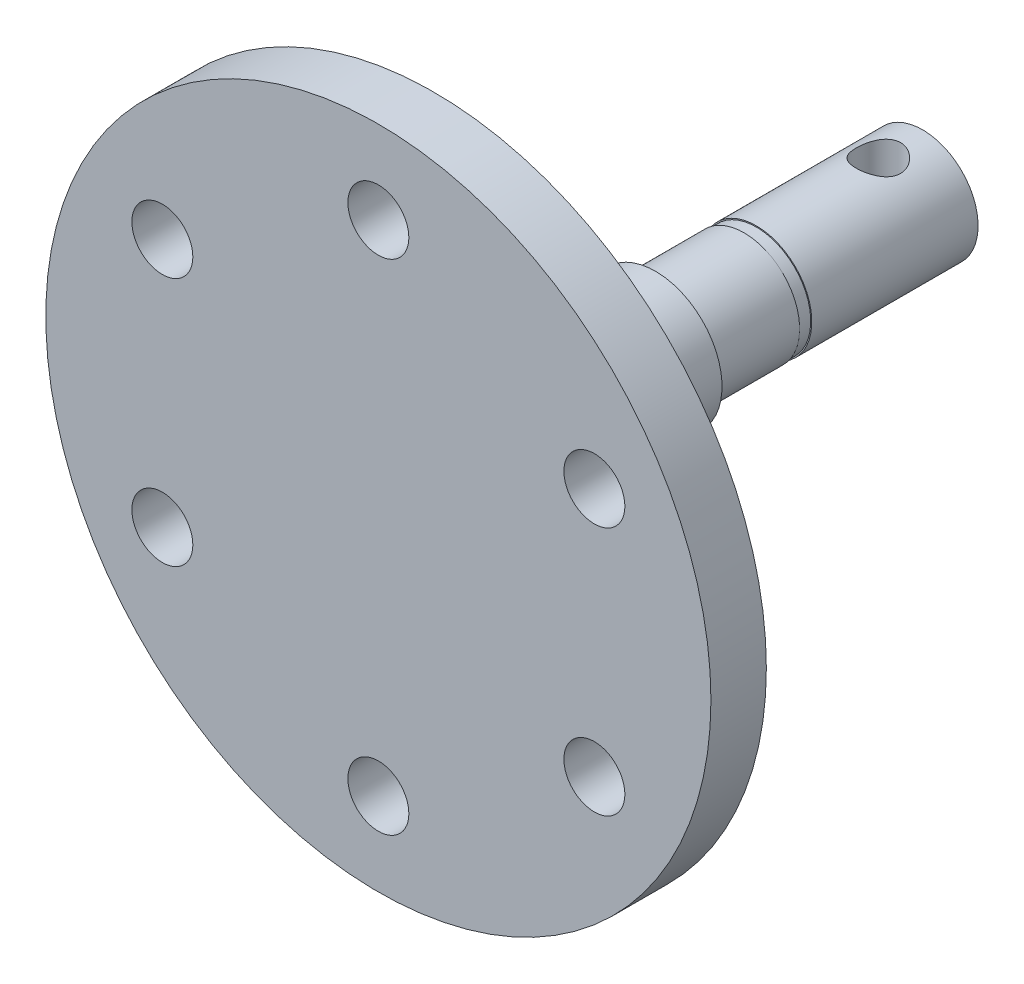
ISO-10303-21;
HEADER;
FILE_DESCRIPTION(('STEP AP214'),'2;1');
FILE_NAME('part.step','',(''),(''),'','','');
FILE_SCHEMA(('AUTOMOTIVE_DESIGN { 1 0 10303 214 1 1 1 1 }'));
ENDSEC;
DATA;
#1=APPLICATION_CONTEXT('core data for automotive mechanical design processes');
#2=APPLICATION_PROTOCOL_DEFINITION('international standard','automotive_design',2000,#1);
#3=PRODUCT_CONTEXT('',#1,'mechanical');
#4=PRODUCT('Part','Part','',(#3));
#5=PRODUCT_RELATED_PRODUCT_CATEGORY('part','',(#4));
#6=PRODUCT_DEFINITION_FORMATION('','',#4);
#7=PRODUCT_DEFINITION_CONTEXT('part definition',#1,'design');
#8=PRODUCT_DEFINITION('design','',#6,#7);
#9=PRODUCT_DEFINITION_SHAPE('','',#8);
#10=(LENGTH_UNIT() NAMED_UNIT(*) SI_UNIT(.MILLI.,.METRE.));
#11=(NAMED_UNIT(*) PLANE_ANGLE_UNIT() SI_UNIT($,.RADIAN.));
#12=(NAMED_UNIT(*) SI_UNIT($,.STERADIAN.) SOLID_ANGLE_UNIT());
#13=UNCERTAINTY_MEASURE_WITH_UNIT(LENGTH_MEASURE(1.E-05),#10,'distance_accuracy_value','');
#14=(GEOMETRIC_REPRESENTATION_CONTEXT(3) GLOBAL_UNCERTAINTY_ASSIGNED_CONTEXT((#13)) GLOBAL_UNIT_ASSIGNED_CONTEXT((#10,
#11,#12)) REPRESENTATION_CONTEXT('',''));
#15=CARTESIAN_POINT('',(0.,0.,0.));
#16=DIRECTION('',(0.,0.,1.));
#17=DIRECTION('',(1.,0.,0.));
#18=AXIS2_PLACEMENT_3D('',#15,#16,#17);
#19=CARTESIAN_POINT('',(0.,0.,-44.1));
#20=DIRECTION('',(0.,0.,1.));
#21=DIRECTION('',(1.,0.,0.));
#22=AXIS2_PLACEMENT_3D('',#19,#20,#21);
#23=CYLINDRICAL_SURFACE('',#22,5.);
#24=CARTESIAN_POINT('',(0.,0.,-44.1));
#25=DIRECTION('',(0.,0.,-1.));
#26=DIRECTION('',(-1.,0.,0.));
#27=AXIS2_PLACEMENT_3D('',#24,#25,#26);
#28=CIRCLE('',#27,5.);
#29=CARTESIAN_POINT('',(-5.,0.,-44.1));
#30=VERTEX_POINT('',#29);
#31=EDGE_CURVE('E149',#30,#30,#28,.T.);
#32=ORIENTED_EDGE('',*,*,#31,.F.);
#33=EDGE_LOOP('',(#32));
#34=FACE_BOUND('',#33,.T.);
#35=CARTESIAN_POINT('',(0.,0.,-29.1));
#36=DIRECTION('',(0.,0.,-1.));
#37=DIRECTION('',(-1.,0.,0.));
#38=AXIS2_PLACEMENT_3D('',#35,#36,#37);
#39=CIRCLE('',#38,5.);
#40=CARTESIAN_POINT('',(-5.,0.,-29.1));
#41=VERTEX_POINT('',#40);
#42=EDGE_CURVE('E153',#41,#41,#39,.T.);
#43=ORIENTED_EDGE('',*,*,#42,.T.);
#44=EDGE_LOOP('',(#43));
#45=FACE_BOUND('',#44,.T.);
#46=CARTESIAN_POINT('',(0.,-5.,-42.1));
#47=CARTESIAN_POINT('',(0.107493005442891,-4.99999271227085,-42.0999901481763));
#48=CARTESIAN_POINT('',(0.215172564090672,-4.99649294306933,-42.0912822479116));
#49=CARTESIAN_POINT('',(0.427496480417895,-4.98283453100642,-42.0567522964788));
#50=CARTESIAN_POINT('',(0.532131777561248,-4.97265778698877,-42.0308837209139));
#51=CARTESIAN_POINT('',(0.734953922727403,-4.94674209213118,-41.9631239219412));
#52=CARTESIAN_POINT('',(0.833160661616959,-4.93102136364072,-41.9212851537833));
#53=CARTESIAN_POINT('',(1.02107197032837,-4.89556610796078,-41.8229808266735));
#54=CARTESIAN_POINT('',(1.11077947675099,-4.87583297458057,-41.7665203450811));
#55=CARTESIAN_POINT('',(1.28350100757039,-4.83330886170419,-41.6377645014391));
#56=CARTESIAN_POINT('',(1.36606227255021,-4.81042296929191,-41.5648933437597));
#57=CARTESIAN_POINT('',(1.51817500478472,-4.76460576906195,-41.4065999965232));
#58=CARTESIAN_POINT('',(1.58772010713353,-4.74167444453792,-41.3211717027883));
#59=CARTESIAN_POINT('',(1.71487456729288,-4.69722791797136,-41.1355719297577));
#60=CARTESIAN_POINT('',(1.77181498119547,-4.67582115964951,-41.0349135139768));
#61=CARTESIAN_POINT('',(1.86775471903715,-4.63833647186793,-40.82446360158));
#62=CARTESIAN_POINT('',(1.90676256428583,-4.62225601244176,-40.7146764721516));
#63=CARTESIAN_POINT('',(1.96389882339587,-4.59826357660818,-40.4942876664079));
#64=CARTESIAN_POINT('',(1.98289396580565,-4.59001420355605,-40.3839487644238));
#65=CARTESIAN_POINT('',(2.00217296164003,-4.58164004049144,-40.1613650016927));
#66=CARTESIAN_POINT('',(2.00246601631322,-4.58151125522768,-40.049121105375));
#67=CARTESIAN_POINT('',(1.98498936750454,-4.58910500279994,-39.834243328542));
#68=CARTESIAN_POINT('',(1.96847531430514,-4.5962817503845,-39.731484285591));
#69=CARTESIAN_POINT('',(1.91994688029782,-4.61676187607836,-39.5303404439933));
#70=CARTESIAN_POINT('',(1.88792979480463,-4.63006632321673,-39.4319564118897));
#71=CARTESIAN_POINT('',(1.80869473255107,-4.6615948508853,-39.239982163804));
#72=CARTESIAN_POINT('',(1.76117986231532,-4.67991379280788,-39.1465307609453));
#73=CARTESIAN_POINT('',(1.65250646073221,-4.7193811638989,-38.9685841836384));
#74=CARTESIAN_POINT('',(1.59134280510084,-4.74053065456848,-38.8840923905972));
#75=CARTESIAN_POINT('',(1.45155059945443,-4.78526736742271,-38.719590271198));
#76=CARTESIAN_POINT('',(1.37193746297063,-4.80891664976152,-38.640431270554));
#77=CARTESIAN_POINT('',(1.20031442743019,-4.85459824958282,-38.496315521998));
#78=CARTESIAN_POINT('',(1.10830206533443,-4.87663024445325,-38.4313616025897));
#79=CARTESIAN_POINT('',(0.912077652605842,-4.91714681264548,-38.3163825525842));
#80=CARTESIAN_POINT('',(0.807660491346476,-4.93555270095415,-38.2666777188029));
#81=CARTESIAN_POINT('',(0.59102376548288,-4.96614828328759,-38.1858321389219));
#82=CARTESIAN_POINT('',(0.478808196849672,-4.97834113462382,-38.1546819624426));
#83=CARTESIAN_POINT('',(0.256895887607818,-4.99456139506911,-38.1135517045803));
#84=CARTESIAN_POINT('',(0.147443293985534,-4.99902945833514,-38.1024275457464));
#85=CARTESIAN_POINT('',(-0.0718453098078174,-5.00068478510631,-38.0982868994714));
#86=CARTESIAN_POINT('',(-0.181681213223924,-4.99787393582291,-38.1052657184525));
#87=CARTESIAN_POINT('',(-0.393432739121987,-4.98557567063753,-38.136291752552));
#88=CARTESIAN_POINT('',(-0.495482491775473,-4.97639391345523,-38.159557980351));
#89=CARTESIAN_POINT('',(-0.69413542806078,-4.952594414055,-38.2214357083098));
#90=CARTESIAN_POINT('',(-0.790737910224845,-4.9379759735653,-38.2600491796687));
#91=CARTESIAN_POINT('',(-0.979078785816702,-4.90416594770812,-38.3527849396799));
#92=CARTESIAN_POINT('',(-1.0705780227554,-4.88484815979804,-38.4073454720431));
#93=CARTESIAN_POINT('',(-1.24344359124655,-4.84373364745525,-38.5299403239056));
#94=CARTESIAN_POINT('',(-1.32480584076112,-4.82193593110271,-38.5979800429226));
#95=CARTESIAN_POINT('',(-1.48072304302882,-4.77645117638112,-38.7508700129496));
#96=CARTESIAN_POINT('',(-1.55447393380606,-4.75273441425052,-38.8365335415062));
#97=CARTESIAN_POINT('',(-1.68675119741371,-4.70741672917132,-39.0194400830094));
#98=CARTESIAN_POINT('',(-1.74527506133751,-4.68581615526511,-39.1166850003399));
#99=CARTESIAN_POINT('',(-1.84580750193163,-4.64714299907709,-39.3214616945941));
#100=CARTESIAN_POINT('',(-1.88765059453445,-4.63011630884788,-39.4290839992123));
#101=CARTESIAN_POINT('',(-1.9522962197053,-4.60323673477931,-39.6507336517152));
#102=CARTESIAN_POINT('',(-1.97511280526931,-4.59337855695998,-39.7647562058124));
#103=CARTESIAN_POINT('',(-1.9997156172784,-4.58271759299926,-39.9871279017745));
#104=CARTESIAN_POINT('',(-2.00289708230287,-4.58131421008171,-40.0952948395933));
#105=CARTESIAN_POINT('',(-1.99180315927753,-4.58614836033098,-40.3105448577133));
#106=CARTESIAN_POINT('',(-1.97752998791378,-4.59238492324793,-40.4176280739026));
#107=CARTESIAN_POINT('',(-1.93307136615365,-4.61126649079021,-40.623332189855));
#108=CARTESIAN_POINT('',(-1.90353749357098,-4.62364831827449,-40.722120274433));
#109=CARTESIAN_POINT('',(-1.83000544849101,-4.65324001232697,-40.9133786296135));
#110=CARTESIAN_POINT('',(-1.78600328139381,-4.67045121206007,-41.0058471468998));
#111=CARTESIAN_POINT('',(-1.68187276275973,-4.70898609604492,-41.1876096192708));
#112=CARTESIAN_POINT('',(-1.62096533515949,-4.73048882313242,-41.2764186701305));
#113=CARTESIAN_POINT('',(-1.4858921192715,-4.77463804372237,-41.4429933172038));
#114=CARTESIAN_POINT('',(-1.41172233481812,-4.79728488048406,-41.5207555721283));
#115=CARTESIAN_POINT('',(-1.24650550627246,-4.84293567087394,-41.6682028532636));
#116=CARTESIAN_POINT('',(-1.15467600114614,-4.86586757962185,-41.7370373068981));
#117=CARTESIAN_POINT('',(-0.959900320285779,-4.90800406713717,-41.8583370426216));
#118=CARTESIAN_POINT('',(-0.856949004547238,-4.92720691092906,-41.9107947121525));
#119=CARTESIAN_POINT('',(-0.644738062495205,-4.95939714815861,-41.9966222151903));
#120=CARTESIAN_POINT('',(-0.535631618219697,-4.97249363055028,-42.0303293235603));
#121=CARTESIAN_POINT('',(-0.312876546281221,-4.99144306209366,-42.0786391209543));
#122=CARTESIAN_POINT('',(-0.199243525858912,-4.99731899495638,-42.0933024367439));
#123=CARTESIAN_POINT('',(-0.0569122978909287,-4.99975899504136,-42.0993953809783));
#124=CARTESIAN_POINT('',(-0.0284626887407579,-5.00000192969176,-42.1000026086292));
#125=CARTESIAN_POINT('',(0.,-5.,-42.1));
#126=B_SPLINE_CURVE_WITH_KNOTS('',3,(#46,#47,#48,#49,#50,#51,#52,#53,#54,#55,#56,#57,#58,#59,
#60,#61,#62,#63,#64,#65,#66,#67,#68,#69,#70,#71,#72,#73,#74,#75,#76,#77,#78,#79,#80,#81,#82,#83,
#84,#85,#86,#87,#88,#89,#90,#91,#92,#93,#94,#95,#96,#97,#98,#99,#100,#101,#102,#103,#104,#105,
#106,#107,#108,#109,#110,#111,#112,#113,#114,#115,#116,#117,#118,#119,#120,#121,#122,#123,#124,
#125),.UNSPECIFIED.,.T.,.F.,(4,2,2,2,2,2,2,2,2,2,2,2,2,2,2,2,2,2,2,2,2,2,2,2,2,2,2,2,2,2,2,2,2,
2,2,2,2,2,2,4),(0.,0.32240298789307,0.645683636007934,0.96791145747158,1.29002753567984,
1.62597381700397,1.96208394934412,2.31315258819217,2.66405423118268,2.99904105308829,
3.33386306340488,3.64538328401372,3.95695787256048,4.27489126298815,4.59294421938184,
4.93558349186558,5.27829092839733,5.62776913162806,5.97706956113791,6.30569184528008,
6.63422893570082,6.94800455564366,7.26182048993797,7.58523513398263,7.90877959498969,
8.25368474624414,8.59864669043748,8.94695045140828,9.29499672645933,9.61799673392747,
9.94095572563046,10.2511431854877,10.5614163580516,10.8894546805669,11.2175920134839,
11.5670042353384,11.9165786364053,12.2596430101332,12.6016125240434,12.686980458968),.UNSPECIFIED.);
#127=CARTESIAN_POINT('',(0.,-5.,-42.1));
#128=VERTEX_POINT('',#127);
#129=EDGE_CURVE('E112',#128,#128,#126,.T.);
#130=ORIENTED_EDGE('',*,*,#129,.F.);
#131=EDGE_LOOP('',(#130));
#132=FACE_BOUND('',#131,.T.);
#133=CARTESIAN_POINT('',(0.,5.,-42.1));
#134=CARTESIAN_POINT('',(-0.107493005442891,4.99999271227085,-42.0999901481763));
#135=CARTESIAN_POINT('',(-0.215172564090672,4.99649294306933,-42.0912822479116));
#136=CARTESIAN_POINT('',(-0.427496480417895,4.98283453100642,-42.0567522964788));
#137=CARTESIAN_POINT('',(-0.532131777561248,4.97265778698877,-42.0308837209139));
#138=CARTESIAN_POINT('',(-0.734953922727403,4.94674209213118,-41.9631239219412));
#139=CARTESIAN_POINT('',(-0.833160661616959,4.93102136364072,-41.9212851537833));
#140=CARTESIAN_POINT('',(-1.02107197032837,4.89556610796078,-41.8229808266735));
#141=CARTESIAN_POINT('',(-1.11077947675099,4.87583297458057,-41.7665203450811));
#142=CARTESIAN_POINT('',(-1.28350100757039,4.83330886170419,-41.6377645014391));
#143=CARTESIAN_POINT('',(-1.36606227255021,4.81042296929191,-41.5648933437597));
#144=CARTESIAN_POINT('',(-1.51817500478472,4.76460576906195,-41.4065999965232));
#145=CARTESIAN_POINT('',(-1.58772010713353,4.74167444453792,-41.3211717027883));
#146=CARTESIAN_POINT('',(-1.71487456729288,4.69722791797136,-41.1355719297577));
#147=CARTESIAN_POINT('',(-1.77181498119547,4.67582115964951,-41.0349135139768));
#148=CARTESIAN_POINT('',(-1.86775471903715,4.63833647186793,-40.82446360158));
#149=CARTESIAN_POINT('',(-1.90676256428583,4.62225601244176,-40.7146764721516));
#150=CARTESIAN_POINT('',(-1.96389882339587,4.59826357660818,-40.4942876664079));
#151=CARTESIAN_POINT('',(-1.98289396580565,4.59001420355605,-40.3839487644238));
#152=CARTESIAN_POINT('',(-2.00217296164003,4.58164004049144,-40.1613650016927));
#153=CARTESIAN_POINT('',(-2.00246601631322,4.58151125522768,-40.049121105375));
#154=CARTESIAN_POINT('',(-1.98498936750454,4.58910500279994,-39.834243328542));
#155=CARTESIAN_POINT('',(-1.96847531430514,4.5962817503845,-39.731484285591));
#156=CARTESIAN_POINT('',(-1.91994688029782,4.61676187607836,-39.5303404439933));
#157=CARTESIAN_POINT('',(-1.88792979480463,4.63006632321673,-39.4319564118897));
#158=CARTESIAN_POINT('',(-1.80869473255107,4.6615948508853,-39.239982163804));
#159=CARTESIAN_POINT('',(-1.76117986231532,4.67991379280788,-39.1465307609453));
#160=CARTESIAN_POINT('',(-1.65250646073221,4.7193811638989,-38.9685841836384));
#161=CARTESIAN_POINT('',(-1.59134280510084,4.74053065456848,-38.8840923905972));
#162=CARTESIAN_POINT('',(-1.45155059945443,4.78526736742271,-38.719590271198));
#163=CARTESIAN_POINT('',(-1.37193746297063,4.80891664976152,-38.640431270554));
#164=CARTESIAN_POINT('',(-1.20031442743019,4.85459824958282,-38.496315521998));
#165=CARTESIAN_POINT('',(-1.10830206533443,4.87663024445325,-38.4313616025897));
#166=CARTESIAN_POINT('',(-0.912077652605842,4.91714681264548,-38.3163825525842));
#167=CARTESIAN_POINT('',(-0.807660491346476,4.93555270095415,-38.2666777188029));
#168=CARTESIAN_POINT('',(-0.59102376548288,4.96614828328759,-38.1858321389219));
#169=CARTESIAN_POINT('',(-0.478808196849672,4.97834113462382,-38.1546819624426));
#170=CARTESIAN_POINT('',(-0.256895887607818,4.99456139506911,-38.1135517045803));
#171=CARTESIAN_POINT('',(-0.147443293985534,4.99902945833514,-38.1024275457464));
#172=CARTESIAN_POINT('',(0.0718453098078174,5.00068478510631,-38.0982868994714));
#173=CARTESIAN_POINT('',(0.181681213223924,4.99787393582291,-38.1052657184525));
#174=CARTESIAN_POINT('',(0.393432739121987,4.98557567063753,-38.136291752552));
#175=CARTESIAN_POINT('',(0.495482491775473,4.97639391345523,-38.159557980351));
#176=CARTESIAN_POINT('',(0.69413542806078,4.952594414055,-38.2214357083098));
#177=CARTESIAN_POINT('',(0.790737910224845,4.9379759735653,-38.2600491796687));
#178=CARTESIAN_POINT('',(0.979078785816702,4.90416594770812,-38.3527849396799));
#179=CARTESIAN_POINT('',(1.0705780227554,4.88484815979804,-38.4073454720431));
#180=CARTESIAN_POINT('',(1.24344359124655,4.84373364745525,-38.5299403239056));
#181=CARTESIAN_POINT('',(1.32480584076112,4.82193593110271,-38.5979800429226));
#182=CARTESIAN_POINT('',(1.48072304302882,4.77645117638112,-38.7508700129496));
#183=CARTESIAN_POINT('',(1.55447393380606,4.75273441425052,-38.8365335415062));
#184=CARTESIAN_POINT('',(1.68675119741371,4.70741672917132,-39.0194400830094));
#185=CARTESIAN_POINT('',(1.74527506133751,4.68581615526511,-39.1166850003399));
#186=CARTESIAN_POINT('',(1.84580750193163,4.64714299907709,-39.3214616945941));
#187=CARTESIAN_POINT('',(1.88765059453445,4.63011630884788,-39.4290839992123));
#188=CARTESIAN_POINT('',(1.9522962197053,4.60323673477931,-39.6507336517152));
#189=CARTESIAN_POINT('',(1.97511280526931,4.59337855695998,-39.7647562058124));
#190=CARTESIAN_POINT('',(1.9997156172784,4.58271759299926,-39.9871279017745));
#191=CARTESIAN_POINT('',(2.00289708230287,4.58131421008171,-40.0952948395933));
#192=CARTESIAN_POINT('',(1.99180315927753,4.58614836033098,-40.3105448577133));
#193=CARTESIAN_POINT('',(1.97752998791378,4.59238492324793,-40.4176280739026));
#194=CARTESIAN_POINT('',(1.93307136615365,4.61126649079021,-40.623332189855));
#195=CARTESIAN_POINT('',(1.90353749357098,4.62364831827449,-40.722120274433));
#196=CARTESIAN_POINT('',(1.83000544849101,4.65324001232697,-40.9133786296135));
#197=CARTESIAN_POINT('',(1.78600328139381,4.67045121206007,-41.0058471468998));
#198=CARTESIAN_POINT('',(1.68187276275973,4.70898609604492,-41.1876096192708));
#199=CARTESIAN_POINT('',(1.62096533515949,4.73048882313242,-41.2764186701305));
#200=CARTESIAN_POINT('',(1.4858921192715,4.77463804372237,-41.4429933172038));
#201=CARTESIAN_POINT('',(1.41172233481812,4.79728488048406,-41.5207555721283));
#202=CARTESIAN_POINT('',(1.24650550627246,4.84293567087394,-41.6682028532636));
#203=CARTESIAN_POINT('',(1.15467600114614,4.86586757962185,-41.7370373068981));
#204=CARTESIAN_POINT('',(0.959900320285779,4.90800406713717,-41.8583370426216));
#205=CARTESIAN_POINT('',(0.856949004547238,4.92720691092906,-41.9107947121525));
#206=CARTESIAN_POINT('',(0.644738062495205,4.95939714815861,-41.9966222151903));
#207=CARTESIAN_POINT('',(0.535631618219697,4.97249363055028,-42.0303293235603));
#208=CARTESIAN_POINT('',(0.312876546281221,4.99144306209366,-42.0786391209543));
#209=CARTESIAN_POINT('',(0.199243525858912,4.99731899495638,-42.0933024367439));
#210=CARTESIAN_POINT('',(0.0569122978909287,4.99975899504136,-42.0993953809783));
#211=CARTESIAN_POINT('',(0.0284626887407579,5.00000192969176,-42.1000026086292));
#212=CARTESIAN_POINT('',(0.,5.,-42.1));
#213=B_SPLINE_CURVE_WITH_KNOTS('',3,(#133,#134,#135,#136,#137,#138,#139,#140,#141,#142,#143,
#144,#145,#146,#147,#148,#149,#150,#151,#152,#153,#154,#155,#156,#157,#158,#159,#160,#161,#162,
#163,#164,#165,#166,#167,#168,#169,#170,#171,#172,#173,#174,#175,#176,#177,#178,#179,#180,#181,
#182,#183,#184,#185,#186,#187,#188,#189,#190,#191,#192,#193,#194,#195,#196,#197,#198,#199,#200,
#201,#202,#203,#204,#205,#206,#207,#208,#209,#210,#211,#212),.UNSPECIFIED.,.T.,.F.,(4,2,2,2,2,2,
2,2,2,2,2,2,2,2,2,2,2,2,2,2,2,2,2,2,2,2,2,2,2,2,2,2,2,2,2,2,2,2,2,4),(0.,0.32240298789307,
0.645683636007934,0.96791145747158,1.29002753567984,1.62597381700397,1.96208394934412,
2.31315258819217,2.66405423118268,2.99904105308829,3.33386306340488,3.64538328401372,
3.95695787256048,4.27489126298815,4.59294421938184,4.93558349186558,5.27829092839733,
5.62776913162806,5.97706956113791,6.30569184528008,6.63422893570082,6.94800455564366,
7.26182048993797,7.58523513398263,7.90877959498969,8.25368474624414,8.59864669043748,
8.94695045140828,9.29499672645933,9.61799673392747,9.94095572563046,10.2511431854877,
10.5614163580516,10.8894546805669,11.2175920134839,11.5670042353384,11.9165786364053,
12.2596430101332,12.6016125240434,12.686980458968),.UNSPECIFIED.);
#214=CARTESIAN_POINT('',(0.,5.,-42.1));
#215=VERTEX_POINT('',#214);
#216=EDGE_CURVE('E37',#215,#215,#213,.T.);
#217=ORIENTED_EDGE('',*,*,#216,.F.);
#218=EDGE_LOOP('',(#217));
#219=FACE_BOUND('',#218,.T.);
#220=ADVANCED_FACE('F33',(#34,#45,#132,#219),#23,.T.);
#221=CARTESIAN_POINT('',(0.,0.,5.));
#222=DIRECTION('',(0.,0.,1.));
#223=DIRECTION('',(1.,0.,0.));
#224=AXIS2_PLACEMENT_3D('',#221,#222,#223);
#225=PLANE('',#224);
#226=CARTESIAN_POINT('',(-19.4855715851498,-11.2500000000001,5.));
#227=DIRECTION('',(0.,0.,1.));
#228=DIRECTION('',(1.,0.,0.));
#229=AXIS2_PLACEMENT_3D('',#226,#227,#228);
#230=CIRCLE('',#229,2.75);
#231=CARTESIAN_POINT('',(-16.7355715851498,-11.2500000000001,5.));
#232=VERTEX_POINT('',#231);
#233=EDGE_CURVE('E76',#232,#232,#230,.T.);
#234=ORIENTED_EDGE('',*,*,#233,.F.);
#235=EDGE_LOOP('',(#234));
#236=FACE_BOUND('',#235,.T.);
#237=CARTESIAN_POINT('',(19.4855715851499,-11.2499999999999,5.));
#238=DIRECTION('',(0.,0.,1.));
#239=DIRECTION('',(1.,0.,0.));
#240=AXIS2_PLACEMENT_3D('',#237,#238,#239);
#241=CIRCLE('',#240,2.75);
#242=CARTESIAN_POINT('',(22.2355715851499,-11.2499999999999,5.));
#243=VERTEX_POINT('',#242);
#244=EDGE_CURVE('E88',#243,#243,#241,.T.);
#245=ORIENTED_EDGE('',*,*,#244,.F.);
#246=EDGE_LOOP('',(#245));
#247=FACE_BOUND('',#246,.T.);
#248=CARTESIAN_POINT('',(0.,22.5,5.));
#249=DIRECTION('',(0.,0.,1.));
#250=DIRECTION('',(1.,0.,0.));
#251=AXIS2_PLACEMENT_3D('',#248,#249,#250);
#252=CIRCLE('',#251,2.75);
#253=CARTESIAN_POINT('',(2.75,22.5,5.));
#254=VERTEX_POINT('',#253);
#255=EDGE_CURVE('E100',#254,#254,#252,.T.);
#256=ORIENTED_EDGE('',*,*,#255,.F.);
#257=EDGE_LOOP('',(#256));
#258=FACE_BOUND('',#257,.T.);
#259=CARTESIAN_POINT('',(0.,0.,5.));
#260=DIRECTION('',(0.,0.,1.));
#261=DIRECTION('',(1.,0.,0.));
#262=AXIS2_PLACEMENT_3D('',#259,#260,#261);
#263=CIRCLE('',#262,30.);
#264=CARTESIAN_POINT('',(30.,0.,5.));
#265=VERTEX_POINT('',#264);
#266=EDGE_CURVE('E106',#265,#265,#263,.T.);
#267=ORIENTED_EDGE('',*,*,#266,.T.);
#268=EDGE_LOOP('',(#267));
#269=FACE_BOUND('',#268,.T.);
#270=CARTESIAN_POINT('',(19.4855715851498,11.2500000000001,5.));
#271=DIRECTION('',(0.,0.,1.));
#272=DIRECTION('',(1.,0.,0.));
#273=AXIS2_PLACEMENT_3D('',#270,#271,#272);
#274=CIRCLE('',#273,2.75);
#275=CARTESIAN_POINT('',(22.2355715851498,11.2500000000001,5.));
#276=VERTEX_POINT('',#275);
#277=EDGE_CURVE('E94',#276,#276,#274,.T.);
#278=ORIENTED_EDGE('',*,*,#277,.F.);
#279=EDGE_LOOP('',(#278));
#280=FACE_BOUND('',#279,.T.);
#281=CARTESIAN_POINT('',(0.,-22.5,5.));
#282=DIRECTION('',(0.,0.,1.));
#283=DIRECTION('',(1.,0.,0.));
#284=AXIS2_PLACEMENT_3D('',#281,#282,#283);
#285=CIRCLE('',#284,2.75);
#286=CARTESIAN_POINT('',(2.75,-22.5,5.));
#287=VERTEX_POINT('',#286);
#288=EDGE_CURVE('E82',#287,#287,#285,.T.);
#289=ORIENTED_EDGE('',*,*,#288,.F.);
#290=EDGE_LOOP('',(#289));
#291=FACE_BOUND('',#290,.T.);
#292=CARTESIAN_POINT('',(-19.4855715851499,11.2499999999999,5.));
#293=DIRECTION('',(0.,0.,1.));
#294=DIRECTION('',(1.,0.,0.));
#295=AXIS2_PLACEMENT_3D('',#292,#293,#294);
#296=CIRCLE('',#295,2.75);
#297=CARTESIAN_POINT('',(-16.7355715851499,11.2499999999999,5.));
#298=VERTEX_POINT('',#297);
#299=EDGE_CURVE('E70',#298,#298,#296,.T.);
#300=ORIENTED_EDGE('',*,*,#299,.F.);
#301=EDGE_LOOP('',(#300));
#302=FACE_BOUND('',#301,.T.);
#303=ADVANCED_FACE('F138',(#236,#247,#258,#269,#280,#291,#302),#225,.T.);
#304=CARTESIAN_POINT('',(0.,0.,0.));
#305=DIRECTION('',(0.,0.,1.));
#306=DIRECTION('',(1.,0.,0.));
#307=AXIS2_PLACEMENT_3D('',#304,#305,#306);
#308=PLANE('',#307);
#309=CARTESIAN_POINT('',(0.,0.,0.));
#310=DIRECTION('',(0.,0.,1.));
#311=DIRECTION('',(1.,0.,0.));
#312=AXIS2_PLACEMENT_3D('',#309,#310,#311);
#313=CIRCLE('',#312,12.);
#314=CARTESIAN_POINT('',(12.,0.,0.));
#315=VERTEX_POINT('',#314);
#316=EDGE_CURVE('E66',#315,#315,#313,.F.);
#317=ORIENTED_EDGE('',*,*,#316,.F.);
#318=EDGE_LOOP('',(#317));
#319=FACE_BOUND('',#318,.T.);
#320=CARTESIAN_POINT('',(0.,0.,0.));
#321=DIRECTION('',(0.,0.,1.));
#322=DIRECTION('',(1.,0.,0.));
#323=AXIS2_PLACEMENT_3D('',#320,#321,#322);
#324=CIRCLE('',#323,30.);
#325=CARTESIAN_POINT('',(30.,0.,0.));
#326=VERTEX_POINT('',#325);
#327=EDGE_CURVE('E103',#326,#326,#324,.T.);
#328=ORIENTED_EDGE('',*,*,#327,.F.);
#329=EDGE_LOOP('',(#328));
#330=FACE_BOUND('',#329,.T.);
#331=CARTESIAN_POINT('',(0.,22.5,0.));
#332=DIRECTION('',(0.,0.,1.));
#333=DIRECTION('',(1.,0.,0.));
#334=AXIS2_PLACEMENT_3D('',#331,#332,#333);
#335=CIRCLE('',#334,2.75);
#336=CARTESIAN_POINT('',(2.75,22.5,0.));
#337=VERTEX_POINT('',#336);
#338=EDGE_CURVE('E97',#337,#337,#335,.T.);
#339=ORIENTED_EDGE('',*,*,#338,.T.);
#340=EDGE_LOOP('',(#339));
#341=FACE_BOUND('',#340,.T.);
#342=CARTESIAN_POINT('',(19.4855715851498,11.2500000000001,0.));
#343=DIRECTION('',(0.,0.,1.));
#344=DIRECTION('',(1.,0.,0.));
#345=AXIS2_PLACEMENT_3D('',#342,#343,#344);
#346=CIRCLE('',#345,2.75);
#347=CARTESIAN_POINT('',(22.2355715851498,11.2500000000001,0.));
#348=VERTEX_POINT('',#347);
#349=EDGE_CURVE('E91',#348,#348,#346,.T.);
#350=ORIENTED_EDGE('',*,*,#349,.T.);
#351=EDGE_LOOP('',(#350));
#352=FACE_BOUND('',#351,.T.);
#353=CARTESIAN_POINT('',(19.4855715851499,-11.2499999999999,0.));
#354=DIRECTION('',(0.,0.,1.));
#355=DIRECTION('',(1.,0.,0.));
#356=AXIS2_PLACEMENT_3D('',#353,#354,#355);
#357=CIRCLE('',#356,2.75);
#358=CARTESIAN_POINT('',(22.2355715851499,-11.2499999999999,0.));
#359=VERTEX_POINT('',#358);
#360=EDGE_CURVE('E85',#359,#359,#357,.T.);
#361=ORIENTED_EDGE('',*,*,#360,.T.);
#362=EDGE_LOOP('',(#361));
#363=FACE_BOUND('',#362,.T.);
#364=CARTESIAN_POINT('',(0.,-22.5,0.));
#365=DIRECTION('',(0.,0.,1.));
#366=DIRECTION('',(1.,0.,0.));
#367=AXIS2_PLACEMENT_3D('',#364,#365,#366);
#368=CIRCLE('',#367,2.75);
#369=CARTESIAN_POINT('',(2.75,-22.5,0.));
#370=VERTEX_POINT('',#369);
#371=EDGE_CURVE('E79',#370,#370,#368,.T.);
#372=ORIENTED_EDGE('',*,*,#371,.T.);
#373=EDGE_LOOP('',(#372));
#374=FACE_BOUND('',#373,.T.);
#375=CARTESIAN_POINT('',(-19.4855715851498,-11.2500000000001,0.));
#376=DIRECTION('',(0.,0.,1.));
#377=DIRECTION('',(1.,0.,0.));
#378=AXIS2_PLACEMENT_3D('',#375,#376,#377);
#379=CIRCLE('',#378,2.75);
#380=CARTESIAN_POINT('',(-16.7355715851498,-11.2500000000001,0.));
#381=VERTEX_POINT('',#380);
#382=EDGE_CURVE('E73',#381,#381,#379,.T.);
#383=ORIENTED_EDGE('',*,*,#382,.T.);
#384=EDGE_LOOP('',(#383));
#385=FACE_BOUND('',#384,.T.);
#386=CARTESIAN_POINT('',(-19.4855715851499,11.2499999999999,0.));
#387=DIRECTION('',(0.,0.,1.));
#388=DIRECTION('',(1.,0.,0.));
#389=AXIS2_PLACEMENT_3D('',#386,#387,#388);
#390=CIRCLE('',#389,2.75);
#391=CARTESIAN_POINT('',(-16.7355715851499,11.2499999999999,0.));
#392=VERTEX_POINT('',#391);
#393=EDGE_CURVE('E69',#392,#392,#390,.T.);
#394=ORIENTED_EDGE('',*,*,#393,.T.);
#395=EDGE_LOOP('',(#394));
#396=FACE_BOUND('',#395,.T.);
#397=ADVANCED_FACE('F143',(#319,#330,#341,#352,#363,#374,#385,#396),#308,.F.);
#398=CARTESIAN_POINT('',(0.,0.,5.));
#399=DIRECTION('',(0.,0.,-1.));
#400=DIRECTION('',(-1.,0.,0.));
#401=AXIS2_PLACEMENT_3D('',#398,#399,#400);
#402=CYLINDRICAL_SURFACE('',#401,30.);
#403=ORIENTED_EDGE('',*,*,#266,.F.);
#404=EDGE_LOOP('',(#403));
#405=FACE_BOUND('',#404,.T.);
#406=ORIENTED_EDGE('',*,*,#327,.T.);
#407=EDGE_LOOP('',(#406));
#408=FACE_BOUND('',#407,.T.);
#409=ADVANCED_FACE('F35',(#405,#408),#402,.T.);
#410=CARTESIAN_POINT('',(0.,22.5,5.));
#411=DIRECTION('',(0.,0.,-1.));
#412=DIRECTION('',(-1.,0.,0.));
#413=AXIS2_PLACEMENT_3D('',#410,#411,#412);
#414=CYLINDRICAL_SURFACE('',#413,2.75);
#415=ORIENTED_EDGE('',*,*,#255,.T.);
#416=EDGE_LOOP('',(#415));
#417=FACE_BOUND('',#416,.T.);
#418=ORIENTED_EDGE('',*,*,#338,.F.);
#419=EDGE_LOOP('',(#418));
#420=FACE_BOUND('',#419,.T.);
#421=ADVANCED_FACE('F209',(#417,#420),#414,.F.);
#422=CARTESIAN_POINT('',(19.4855715851498,11.2500000000001,5.));
#423=DIRECTION('',(0.,0.,-1.));
#424=DIRECTION('',(-1.,0.,0.));
#425=AXIS2_PLACEMENT_3D('',#422,#423,#424);
#426=CYLINDRICAL_SURFACE('',#425,2.75);
#427=ORIENTED_EDGE('',*,*,#277,.T.);
#428=EDGE_LOOP('',(#427));
#429=FACE_BOUND('',#428,.T.);
#430=ORIENTED_EDGE('',*,*,#349,.F.);
#431=EDGE_LOOP('',(#430));
#432=FACE_BOUND('',#431,.T.);
#433=ADVANCED_FACE('F205',(#429,#432),#426,.F.);
#434=CARTESIAN_POINT('',(19.4855715851499,-11.2499999999999,5.));
#435=DIRECTION('',(0.,0.,-1.));
#436=DIRECTION('',(-1.,0.,0.));
#437=AXIS2_PLACEMENT_3D('',#434,#435,#436);
#438=CYLINDRICAL_SURFACE('',#437,2.75);
#439=ORIENTED_EDGE('',*,*,#244,.T.);
#440=EDGE_LOOP('',(#439));
#441=FACE_BOUND('',#440,.T.);
#442=ORIENTED_EDGE('',*,*,#360,.F.);
#443=EDGE_LOOP('',(#442));
#444=FACE_BOUND('',#443,.T.);
#445=ADVANCED_FACE('F201',(#441,#444),#438,.F.);
#446=CARTESIAN_POINT('',(0.,-22.5,5.));
#447=DIRECTION('',(0.,0.,-1.));
#448=DIRECTION('',(-1.,0.,0.));
#449=AXIS2_PLACEMENT_3D('',#446,#447,#448);
#450=CYLINDRICAL_SURFACE('',#449,2.75);
#451=ORIENTED_EDGE('',*,*,#288,.T.);
#452=EDGE_LOOP('',(#451));
#453=FACE_BOUND('',#452,.T.);
#454=ORIENTED_EDGE('',*,*,#371,.F.);
#455=EDGE_LOOP('',(#454));
#456=FACE_BOUND('',#455,.T.);
#457=ADVANCED_FACE('F197',(#453,#456),#450,.F.);
#458=CARTESIAN_POINT('',(-19.4855715851498,-11.2500000000001,5.));
#459=DIRECTION('',(0.,0.,-1.));
#460=DIRECTION('',(-1.,0.,0.));
#461=AXIS2_PLACEMENT_3D('',#458,#459,#460);
#462=CYLINDRICAL_SURFACE('',#461,2.75);
#463=ORIENTED_EDGE('',*,*,#233,.T.);
#464=EDGE_LOOP('',(#463));
#465=FACE_BOUND('',#464,.T.);
#466=ORIENTED_EDGE('',*,*,#382,.F.);
#467=EDGE_LOOP('',(#466));
#468=FACE_BOUND('',#467,.T.);
#469=ADVANCED_FACE('F193',(#465,#468),#462,.F.);
#470=CARTESIAN_POINT('',(-19.4855715851499,11.2499999999999,5.));
#471=DIRECTION('',(0.,0.,-1.));
#472=DIRECTION('',(-1.,0.,0.));
#473=AXIS2_PLACEMENT_3D('',#470,#471,#472);
#474=CYLINDRICAL_SURFACE('',#473,2.75);
#475=ORIENTED_EDGE('',*,*,#299,.T.);
#476=EDGE_LOOP('',(#475));
#477=FACE_BOUND('',#476,.T.);
#478=ORIENTED_EDGE('',*,*,#393,.F.);
#479=EDGE_LOOP('',(#478));
#480=FACE_BOUND('',#479,.T.);
#481=ADVANCED_FACE('F189',(#477,#480),#474,.F.);
#482=CARTESIAN_POINT('',(0.,0.,-10.));
#483=DIRECTION('',(0.,0.,1.));
#484=DIRECTION('',(1.,0.,0.));
#485=AXIS2_PLACEMENT_3D('',#482,#483,#484);
#486=CYLINDRICAL_SURFACE('',#485,12.);
#487=CARTESIAN_POINT('',(0.,0.,-10.));
#488=DIRECTION('',(0.,0.,-1.));
#489=DIRECTION('',(-1.,0.,0.));
#490=AXIS2_PLACEMENT_3D('',#487,#488,#489);
#491=CIRCLE('',#490,12.);
#492=CARTESIAN_POINT('',(-12.,0.,-10.));
#493=VERTEX_POINT('',#492);
#494=EDGE_CURVE('E63',#493,#493,#491,.T.);
#495=ORIENTED_EDGE('',*,*,#494,.F.);
#496=EDGE_LOOP('',(#495));
#497=FACE_BOUND('',#496,.T.);
#498=ORIENTED_EDGE('',*,*,#316,.T.);
#499=EDGE_LOOP('',(#498));
#500=FACE_BOUND('',#499,.T.);
#501=ADVANCED_FACE('F185',(#497,#500),#486,.T.);
#502=CARTESIAN_POINT('',(0.,0.,-10.));
#503=DIRECTION('',(0.,0.,-1.));
#504=DIRECTION('',(-1.,0.,0.));
#505=AXIS2_PLACEMENT_3D('',#502,#503,#504);
#506=PLANE('',#505);
#507=CARTESIAN_POINT('',(0.,0.,-10.));
#508=DIRECTION('',(0.,0.,-1.));
#509=DIRECTION('',(-1.,0.,0.));
#510=AXIS2_PLACEMENT_3D('',#507,#508,#509);
#511=CIRCLE('',#510,6.);
#512=CARTESIAN_POINT('',(-6.,0.,-10.));
#513=VERTEX_POINT('',#512);
#514=EDGE_CURVE('E51',#513,#513,#511,.T.);
#515=ORIENTED_EDGE('',*,*,#514,.F.);
#516=EDGE_LOOP('',(#515));
#517=FACE_BOUND('',#516,.T.);
#518=ORIENTED_EDGE('',*,*,#494,.T.);
#519=EDGE_LOOP('',(#518));
#520=FACE_BOUND('',#519,.T.);
#521=ADVANCED_FACE('F181',(#517,#520),#506,.T.);
#522=CARTESIAN_POINT('',(0.,0.,-20.));
#523=DIRECTION('',(0.,0.,1.));
#524=DIRECTION('',(1.,0.,0.));
#525=AXIS2_PLACEMENT_3D('',#522,#523,#524);
#526=CYLINDRICAL_SURFACE('',#525,6.);
#527=CARTESIAN_POINT('',(0.,0.,-20.));
#528=DIRECTION('',(0.,0.,-1.));
#529=DIRECTION('',(-1.,0.,0.));
#530=AXIS2_PLACEMENT_3D('',#527,#528,#529);
#531=CIRCLE('',#530,6.);
#532=CARTESIAN_POINT('',(-6.,0.,-20.));
#533=VERTEX_POINT('',#532);
#534=EDGE_CURVE('E59',#533,#533,#531,.T.);
#535=ORIENTED_EDGE('',*,*,#534,.F.);
#536=EDGE_LOOP('',(#535));
#537=FACE_BOUND('',#536,.T.);
#538=ORIENTED_EDGE('',*,*,#514,.T.);
#539=EDGE_LOOP('',(#538));
#540=FACE_BOUND('',#539,.T.);
#541=ADVANCED_FACE('F177',(#537,#540),#526,.T.);
#542=CARTESIAN_POINT('',(0.,0.,-20.));
#543=DIRECTION('',(0.,0.,-1.));
#544=DIRECTION('',(-1.,0.,0.));
#545=AXIS2_PLACEMENT_3D('',#542,#543,#544);
#546=PLANE('',#545);
#547=CARTESIAN_POINT('',(0.,0.,-20.));
#548=DIRECTION('',(0.,0.,-1.));
#549=DIRECTION('',(-1.,0.,0.));
#550=AXIS2_PLACEMENT_3D('',#547,#548,#549);
#551=CIRCLE('',#550,5.);
#552=CARTESIAN_POINT('',(-5.,0.,-20.));
#553=VERTEX_POINT('',#552);
#554=EDGE_CURVE('E46',#553,#553,#551,.T.);
#555=ORIENTED_EDGE('',*,*,#554,.F.);
#556=EDGE_LOOP('',(#555));
#557=FACE_BOUND('',#556,.T.);
#558=ORIENTED_EDGE('',*,*,#534,.T.);
#559=EDGE_LOOP('',(#558));
#560=FACE_BOUND('',#559,.T.);
#561=ADVANCED_FACE('F173',(#557,#560),#546,.T.);
#562=CARTESIAN_POINT('',(0.,0.,-28.));
#563=DIRECTION('',(0.,0.,1.));
#564=DIRECTION('',(1.,0.,0.));
#565=AXIS2_PLACEMENT_3D('',#562,#563,#564);
#566=CYLINDRICAL_SURFACE('',#565,5.);
#567=CARTESIAN_POINT('',(0.,0.,-28.));
#568=DIRECTION('',(0.,0.,-1.));
#569=DIRECTION('',(-1.,0.,0.));
#570=AXIS2_PLACEMENT_3D('',#567,#568,#569);
#571=CIRCLE('',#570,5.);
#572=CARTESIAN_POINT('',(-5.,0.,-28.));
#573=VERTEX_POINT('',#572);
#574=EDGE_CURVE('E57',#573,#573,#571,.T.);
#575=ORIENTED_EDGE('',*,*,#574,.F.);
#576=EDGE_LOOP('',(#575));
#577=FACE_BOUND('',#576,.T.);
#578=ORIENTED_EDGE('',*,*,#554,.T.);
#579=EDGE_LOOP('',(#578));
#580=FACE_BOUND('',#579,.T.);
#581=ADVANCED_FACE('F167',(#577,#580),#566,.T.);
#582=CARTESIAN_POINT('',(0.,0.,-28.));
#583=DIRECTION('',(0.,0.,-1.));
#584=DIRECTION('',(-1.,0.,0.));
#585=AXIS2_PLACEMENT_3D('',#582,#583,#584);
#586=PLANE('',#585);
#587=CARTESIAN_POINT('',(0.,0.,-28.));
#588=DIRECTION('',(0.,0.,-1.));
#589=DIRECTION('',(-1.,0.,0.));
#590=AXIS2_PLACEMENT_3D('',#587,#588,#589);
#591=CIRCLE('',#590,4.9);
#592=CARTESIAN_POINT('',(-4.9,0.,-28.));
#593=VERTEX_POINT('',#592);
#594=EDGE_CURVE('E10',#593,#593,#591,.T.);
#595=ORIENTED_EDGE('',*,*,#594,.F.);
#596=EDGE_LOOP('',(#595));
#597=FACE_BOUND('',#596,.T.);
#598=ORIENTED_EDGE('',*,*,#574,.T.);
#599=EDGE_LOOP('',(#598));
#600=FACE_BOUND('',#599,.T.);
#601=ADVANCED_FACE('F163',(#597,#600),#586,.T.);
#602=CARTESIAN_POINT('',(0.,0.,-29.1));
#603=DIRECTION('',(0.,0.,1.));
#604=DIRECTION('',(1.,0.,0.));
#605=AXIS2_PLACEMENT_3D('',#602,#603,#604);
#606=CYLINDRICAL_SURFACE('',#605,4.9);
#607=CARTESIAN_POINT('',(0.,0.,-29.1));
#608=DIRECTION('',(0.,0.,-1.));
#609=DIRECTION('',(-1.,0.,0.));
#610=AXIS2_PLACEMENT_3D('',#607,#608,#609);
#611=CIRCLE('',#610,4.9);
#612=CARTESIAN_POINT('',(-4.9,0.,-29.1));
#613=VERTEX_POINT('',#612);
#614=EDGE_CURVE('E55',#613,#613,#611,.T.);
#615=ORIENTED_EDGE('',*,*,#614,.F.);
#616=EDGE_LOOP('',(#615));
#617=FACE_BOUND('',#616,.T.);
#618=ORIENTED_EDGE('',*,*,#594,.T.);
#619=EDGE_LOOP('',(#618));
#620=FACE_BOUND('',#619,.T.);
#621=ADVANCED_FACE('F129',(#617,#620),#606,.T.);
#622=CARTESIAN_POINT('',(0.,0.,-44.1));
#623=DIRECTION('',(0.,0.,-1.));
#624=DIRECTION('',(-1.,0.,0.));
#625=AXIS2_PLACEMENT_3D('',#622,#623,#624);
#626=PLANE('',#625);
#627=ORIENTED_EDGE('',*,*,#31,.T.);
#628=EDGE_LOOP('',(#627));
#629=FACE_BOUND('',#628,.T.);
#630=ADVANCED_FACE('F126',(#629),#626,.T.);
#631=CARTESIAN_POINT('',(0.,0.,-29.1));
#632=DIRECTION('',(0.,0.,-1.));
#633=DIRECTION('',(-1.,0.,0.));
#634=AXIS2_PLACEMENT_3D('',#631,#632,#633);
#635=PLANE('',#634);
#636=ORIENTED_EDGE('',*,*,#614,.T.);
#637=EDGE_LOOP('',(#636));
#638=FACE_BOUND('',#637,.T.);
#639=ORIENTED_EDGE('',*,*,#42,.F.);
#640=EDGE_LOOP('',(#639));
#641=FACE_BOUND('',#640,.T.);
#642=ADVANCED_FACE('F124',(#638,#641),#635,.F.);
#643=CARTESIAN_POINT('',(0.,15.,-40.1));
#644=DIRECTION('',(0.,-1.,0.));
#645=DIRECTION('',(0.,0.,-1.));
#646=AXIS2_PLACEMENT_3D('',#643,#644,#645);
#647=CYLINDRICAL_SURFACE('',#646,2.);
#648=ORIENTED_EDGE('',*,*,#129,.T.);
#649=EDGE_LOOP('',(#648));
#650=FACE_BOUND('',#649,.T.);
#651=ORIENTED_EDGE('',*,*,#216,.T.);
#652=EDGE_LOOP('',(#651));
#653=FACE_BOUND('',#652,.T.);
#654=ADVANCED_FACE('F120',(#650,#653),#647,.F.);
#655=CLOSED_SHELL('',(#220,#303,#397,#409,#421,#433,#445,#457,#469,#481,#501,#521,#541,#561,
#581,#601,#621,#630,#642,#654));
#656=MANIFOLD_SOLID_BREP('B2',#655);
#657=ADVANCED_BREP_SHAPE_REPRESENTATION('',(#18,#656),#14);
#658=SHAPE_DEFINITION_REPRESENTATION(#9,#657);
ENDSEC;
END-ISO-10303-21;
